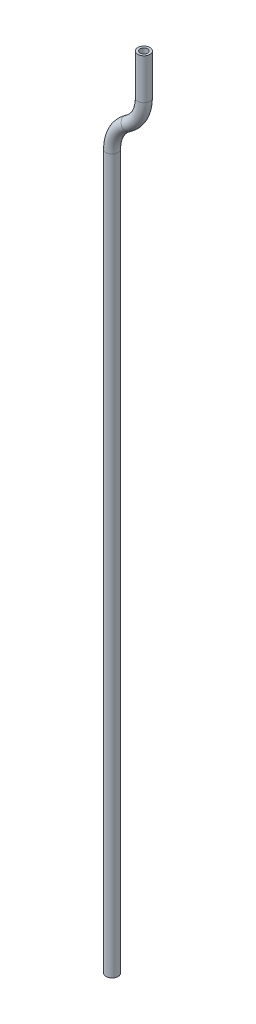
ISO-10303-21;
HEADER;
FILE_DESCRIPTION(('STEP AP214'),'2;1');
FILE_NAME('part.step','',(''),(''),'','','');
FILE_SCHEMA(('AUTOMOTIVE_DESIGN { 1 0 10303 214 1 1 1 1 }'));
ENDSEC;
DATA;
#1=APPLICATION_CONTEXT('core data for automotive mechanical design processes');
#2=APPLICATION_PROTOCOL_DEFINITION('international standard','automotive_design',2000,#1);
#3=PRODUCT_CONTEXT('',#1,'mechanical');
#4=PRODUCT('Part','Part','',(#3));
#5=PRODUCT_RELATED_PRODUCT_CATEGORY('part','',(#4));
#6=PRODUCT_DEFINITION_FORMATION('','',#4);
#7=PRODUCT_DEFINITION_CONTEXT('part definition',#1,'design');
#8=PRODUCT_DEFINITION('design','',#6,#7);
#9=PRODUCT_DEFINITION_SHAPE('','',#8);
#10=(LENGTH_UNIT() NAMED_UNIT(*) SI_UNIT(.MILLI.,.METRE.));
#11=(NAMED_UNIT(*) PLANE_ANGLE_UNIT() SI_UNIT($,.RADIAN.));
#12=(NAMED_UNIT(*) SI_UNIT($,.STERADIAN.) SOLID_ANGLE_UNIT());
#13=UNCERTAINTY_MEASURE_WITH_UNIT(LENGTH_MEASURE(1.E-05),#10,'distance_accuracy_value','');
#14=(GEOMETRIC_REPRESENTATION_CONTEXT(3) GLOBAL_UNCERTAINTY_ASSIGNED_CONTEXT((#13)) GLOBAL_UNIT_ASSIGNED_CONTEXT((#10,
#11,#12)) REPRESENTATION_CONTEXT('',''));
#15=CARTESIAN_POINT('',(0.,0.,0.));
#16=DIRECTION('',(0.,0.,1.));
#17=DIRECTION('',(1.,0.,0.));
#18=AXIS2_PLACEMENT_3D('',#15,#16,#17);
#19=CARTESIAN_POINT('',(13.55,0.,0.));
#20=DIRECTION('',(0.,-1.,0.));
#21=DIRECTION('',(0.,0.,-1.));
#22=AXIS2_PLACEMENT_3D('',#19,#20,#21);
#23=CYLINDRICAL_SURFACE('',#22,2.);
#24=CARTESIAN_POINT('',(13.55,-13.5,0.));
#25=DIRECTION('',(0.,1.,0.));
#26=DIRECTION('',(0.,0.,1.));
#27=AXIS2_PLACEMENT_3D('',#24,#25,#26);
#28=CIRCLE('',#27,2.);
#29=CARTESIAN_POINT('',(15.55,-13.5,0.));
#30=VERTEX_POINT('',#29);
#31=EDGE_CURVE('E55',#30,#30,#28,.T.);
#32=ORIENTED_EDGE('',*,*,#31,.T.);
#33=EDGE_LOOP('',(#32));
#34=FACE_BOUND('',#33,.T.);
#35=CARTESIAN_POINT('',(13.55,0.,0.));
#36=DIRECTION('',(0.,1.,0.));
#37=DIRECTION('',(0.,0.,1.));
#38=AXIS2_PLACEMENT_3D('',#35,#36,#37);
#39=CIRCLE('',#38,2.);
#40=CARTESIAN_POINT('',(13.55,0.,2.));
#41=VERTEX_POINT('',#40);
#42=EDGE_CURVE('E52',#41,#41,#39,.T.);
#43=ORIENTED_EDGE('',*,*,#42,.F.);
#44=EDGE_LOOP('',(#43));
#45=FACE_BOUND('',#44,.T.);
#46=ADVANCED_FACE('F31',(#34,#45),#23,.T.);
#47=CARTESIAN_POINT('',(1.43382701421798,-13.5,0.));
#48=DIRECTION('',(0.,0.,-1.));
#49=DIRECTION('',(-1.,0.,0.));
#50=AXIS2_PLACEMENT_3D('',#47,#48,#49);
#51=TOROIDAL_SURFACE('',#50,12.116172985782,2.);
#52=CARTESIAN_POINT('',(8.27500000000001,-23.5,0.));
#53=DIRECTION('',(0.825343118799535,0.564631504833246,0.));
#54=DIRECTION('',(0.,0.,1.));
#55=AXIS2_PLACEMENT_3D('',#52,#53,#54);
#56=CIRCLE('',#55,2.);
#57=CARTESIAN_POINT('',(9.4042630096665,-25.1506862375991,0.));
#58=VERTEX_POINT('',#57);
#59=EDGE_CURVE('E57',#58,#58,#56,.T.);
#60=CARTESIAN_POINT('',(1.43382701421798,-13.5,0.));
#61=DIRECTION('',(0.,0.,-1.));
#62=DIRECTION('',(-1.,0.,0.));
#63=AXIS2_PLACEMENT_3D('',#60,#61,#62);
#64=CIRCLE('',#63,14.116172985782);
#65=EDGE_CURVE('',#30,#58,#64,.T.);
#66=ORIENTED_EDGE('',*,*,#31,.F.);
#67=ORIENTED_EDGE('',*,*,#59,.T.);
#68=ORIENTED_EDGE('',*,*,#65,.T.);
#69=ORIENTED_EDGE('',*,*,#65,.F.);
#70=EDGE_LOOP('',(#66,#68,#67,#69));
#71=FACE_BOUND('',#70,.T.);
#72=ADVANCED_FACE('F77',(#71),#51,.T.);
#73=CARTESIAN_POINT('',(15.116172985782,-33.5,0.));
#74=DIRECTION('',(0.,0.,1.));
#75=DIRECTION('',(1.,0.,0.));
#76=AXIS2_PLACEMENT_3D('',#73,#74,#75);
#77=TOROIDAL_SURFACE('',#76,12.116172985782,2.);
#78=CARTESIAN_POINT('',(3.,-33.5,0.));
#79=DIRECTION('',(0.,1.,0.));
#80=DIRECTION('',(0.,0.,1.));
#81=AXIS2_PLACEMENT_3D('',#78,#79,#80);
#82=CIRCLE('',#81,2.);
#83=CARTESIAN_POINT('',(3.,-33.5,2.));
#84=VERTEX_POINT('',#83);
#85=EDGE_CURVE('E35',#84,#84,#82,.T.);
#86=ORIENTED_EDGE('',*,*,#85,.T.);
#87=EDGE_LOOP('',(#86));
#88=FACE_BOUND('',#87,.T.);
#89=ORIENTED_EDGE('',*,*,#59,.F.);
#90=EDGE_LOOP('',(#89));
#91=FACE_BOUND('',#90,.T.);
#92=ADVANCED_FACE('F64',(#88,#91),#77,.T.);
#93=CARTESIAN_POINT('',(3.,-33.5,0.));
#94=DIRECTION('',(0.,-1.,0.));
#95=DIRECTION('',(0.,0.,-1.));
#96=AXIS2_PLACEMENT_3D('',#93,#94,#95);
#97=CYLINDRICAL_SURFACE('',#96,2.);
#98=CARTESIAN_POINT('',(3.,-270.5,0.));
#99=DIRECTION('',(0.,1.,0.));
#100=DIRECTION('',(0.,0.,1.));
#101=AXIS2_PLACEMENT_3D('',#98,#99,#100);
#102=CIRCLE('',#101,2.);
#103=CARTESIAN_POINT('',(3.,-270.5,2.));
#104=VERTEX_POINT('',#103);
#105=EDGE_CURVE('E48',#104,#104,#102,.T.);
#106=ORIENTED_EDGE('',*,*,#105,.T.);
#107=EDGE_LOOP('',(#106));
#108=FACE_BOUND('',#107,.T.);
#109=ORIENTED_EDGE('',*,*,#85,.F.);
#110=EDGE_LOOP('',(#109));
#111=FACE_BOUND('',#110,.T.);
#112=ADVANCED_FACE('F33',(#108,#111),#97,.T.);
#113=CARTESIAN_POINT('',(13.55,0.,0.));
#114=DIRECTION('',(0.,1.,0.));
#115=DIRECTION('',(0.,0.,1.));
#116=AXIS2_PLACEMENT_3D('',#113,#114,#115);
#117=PLANE('',#116);
#118=CARTESIAN_POINT('',(13.55,0.,0.));
#119=DIRECTION('',(0.,1.,0.));
#120=DIRECTION('',(0.,0.,1.));
#121=AXIS2_PLACEMENT_3D('',#118,#119,#120);
#122=CIRCLE('',#121,1.25);
#123=CARTESIAN_POINT('',(13.55,0.,1.25));
#124=VERTEX_POINT('',#123);
#125=EDGE_CURVE('E51',#124,#124,#122,.F.);
#126=ORIENTED_EDGE('',*,*,#125,.T.);
#127=EDGE_LOOP('',(#126));
#128=FACE_BOUND('',#127,.T.);
#129=ORIENTED_EDGE('',*,*,#42,.T.);
#130=EDGE_LOOP('',(#129));
#131=FACE_BOUND('',#130,.T.);
#132=ADVANCED_FACE('F68',(#128,#131),#117,.T.);
#133=CARTESIAN_POINT('',(3.,-270.5,0.));
#134=DIRECTION('',(0.,1.,0.));
#135=DIRECTION('',(0.,0.,1.));
#136=AXIS2_PLACEMENT_3D('',#133,#134,#135);
#137=PLANE('',#136);
#138=CARTESIAN_POINT('',(3.,-270.5,0.));
#139=DIRECTION('',(0.,1.,0.));
#140=DIRECTION('',(0.,0.,1.));
#141=AXIS2_PLACEMENT_3D('',#138,#139,#140);
#142=CIRCLE('',#141,1.25);
#143=CARTESIAN_POINT('',(3.,-270.5,1.25));
#144=VERTEX_POINT('',#143);
#145=EDGE_CURVE('E10',#144,#144,#142,.F.);
#146=ORIENTED_EDGE('',*,*,#145,.F.);
#147=EDGE_LOOP('',(#146));
#148=FACE_BOUND('',#147,.T.);
#149=ORIENTED_EDGE('',*,*,#105,.F.);
#150=EDGE_LOOP('',(#149));
#151=FACE_BOUND('',#150,.T.);
#152=ADVANCED_FACE('F74',(#148,#151),#137,.F.);
#153=CARTESIAN_POINT('',(13.55,0.,0.));
#154=DIRECTION('',(0.,-1.,0.));
#155=DIRECTION('',(0.,0.,-1.));
#156=AXIS2_PLACEMENT_3D('',#153,#154,#155);
#157=CYLINDRICAL_SURFACE('',#156,1.25);
#158=CARTESIAN_POINT('',(13.55,-13.5,0.));
#159=DIRECTION('',(0.,1.,0.));
#160=DIRECTION('',(0.,0.,1.));
#161=AXIS2_PLACEMENT_3D('',#158,#159,#160);
#162=CIRCLE('',#161,1.25);
#163=CARTESIAN_POINT('',(14.8,-13.5,0.));
#164=VERTEX_POINT('',#163);
#165=EDGE_CURVE('E164',#164,#164,#162,.F.);
#166=ORIENTED_EDGE('',*,*,#165,.T.);
#167=EDGE_LOOP('',(#166));
#168=FACE_BOUND('',#167,.T.);
#169=ORIENTED_EDGE('',*,*,#125,.F.);
#170=EDGE_LOOP('',(#169));
#171=FACE_BOUND('',#170,.T.);
#172=ADVANCED_FACE('F92',(#168,#171),#157,.F.);
#173=CARTESIAN_POINT('',(1.43382701421798,-13.5,0.));
#174=DIRECTION('',(0.,0.,-1.));
#175=DIRECTION('',(-1.,0.,0.));
#176=AXIS2_PLACEMENT_3D('',#173,#174,#175);
#177=TOROIDAL_SURFACE('',#176,12.116172985782,1.25);
#178=CARTESIAN_POINT('',(8.27500000000001,-23.5,0.));
#179=DIRECTION('',(0.825343118799535,0.564631504833246,0.));
#180=DIRECTION('',(0.,0.,1.));
#181=AXIS2_PLACEMENT_3D('',#178,#179,#180);
#182=CIRCLE('',#181,1.25);
#183=CARTESIAN_POINT('',(8.98078938104157,-24.5316788984994,0.));
#184=VERTEX_POINT('',#183);
#185=EDGE_CURVE('E44',#184,#184,#182,.F.);
#186=CARTESIAN_POINT('',(1.43382701421798,-13.5,0.));
#187=DIRECTION('',(0.,0.,-1.));
#188=DIRECTION('',(-1.,0.,0.));
#189=AXIS2_PLACEMENT_3D('',#186,#187,#188);
#190=CIRCLE('',#189,13.366172985782);
#191=EDGE_CURVE('',#164,#184,#190,.T.);
#192=ORIENTED_EDGE('',*,*,#165,.F.);
#193=ORIENTED_EDGE('',*,*,#185,.T.);
#194=ORIENTED_EDGE('',*,*,#191,.T.);
#195=ORIENTED_EDGE('',*,*,#191,.F.);
#196=EDGE_LOOP('',(#192,#194,#193,#195));
#197=FACE_BOUND('',#196,.T.);
#198=ADVANCED_FACE('F85',(#197),#177,.F.);
#199=CARTESIAN_POINT('',(15.116172985782,-33.5,0.));
#200=DIRECTION('',(0.,0.,1.));
#201=DIRECTION('',(1.,0.,0.));
#202=AXIS2_PLACEMENT_3D('',#199,#200,#201);
#203=TOROIDAL_SURFACE('',#202,12.116172985782,1.25);
#204=CARTESIAN_POINT('',(3.,-33.5,0.));
#205=DIRECTION('',(0.,1.,0.));
#206=DIRECTION('',(0.,0.,1.));
#207=AXIS2_PLACEMENT_3D('',#204,#205,#206);
#208=CIRCLE('',#207,1.25);
#209=CARTESIAN_POINT('',(3.,-33.5,1.25));
#210=VERTEX_POINT('',#209);
#211=EDGE_CURVE('E39',#210,#210,#208,.F.);
#212=ORIENTED_EDGE('',*,*,#211,.T.);
#213=EDGE_LOOP('',(#212));
#214=FACE_BOUND('',#213,.T.);
#215=ORIENTED_EDGE('',*,*,#185,.F.);
#216=EDGE_LOOP('',(#215));
#217=FACE_BOUND('',#216,.T.);
#218=ADVANCED_FACE('F80',(#214,#217),#203,.F.);
#219=CARTESIAN_POINT('',(3.,-33.5,0.));
#220=DIRECTION('',(0.,-1.,0.));
#221=DIRECTION('',(0.,0.,-1.));
#222=AXIS2_PLACEMENT_3D('',#219,#220,#221);
#223=CYLINDRICAL_SURFACE('',#222,1.25);
#224=ORIENTED_EDGE('',*,*,#145,.T.);
#225=EDGE_LOOP('',(#224));
#226=FACE_BOUND('',#225,.T.);
#227=ORIENTED_EDGE('',*,*,#211,.F.);
#228=EDGE_LOOP('',(#227));
#229=FACE_BOUND('',#228,.T.);
#230=ADVANCED_FACE('F78',(#226,#229),#223,.F.);
#231=CLOSED_SHELL('',(#46,#72,#92,#112,#132,#152,#172,#198,#218,#230));
#232=MANIFOLD_SOLID_BREP('B2',#231);
#233=ADVANCED_BREP_SHAPE_REPRESENTATION('',(#18,#232),#14);
#234=SHAPE_DEFINITION_REPRESENTATION(#9,#233);
ENDSEC;
END-ISO-10303-21;
